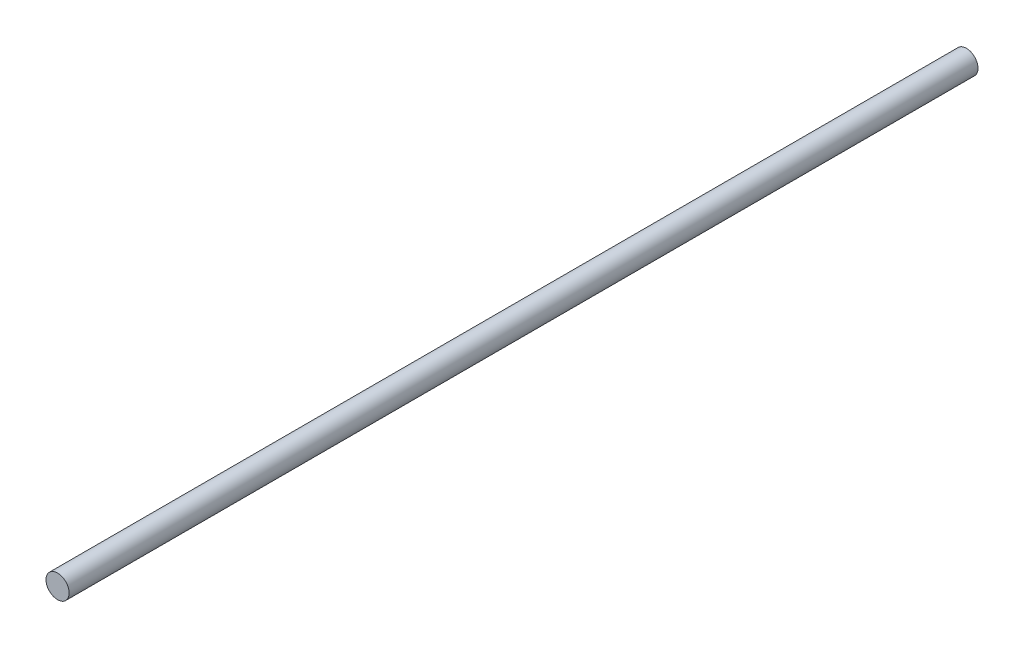
ISO-10303-21;
HEADER;
FILE_DESCRIPTION(('STEP AP214'),'2;1');
FILE_NAME('part.step','',(''),(''),'','','');
FILE_SCHEMA(('AUTOMOTIVE_DESIGN { 1 0 10303 214 1 1 1 1 }'));
ENDSEC;
DATA;
#1=APPLICATION_CONTEXT('core data for automotive mechanical design processes');
#2=APPLICATION_PROTOCOL_DEFINITION('international standard','automotive_design',2000,#1);
#3=PRODUCT_CONTEXT('',#1,'mechanical');
#4=PRODUCT('Part','Part','',(#3));
#5=PRODUCT_RELATED_PRODUCT_CATEGORY('part','',(#4));
#6=PRODUCT_DEFINITION_FORMATION('','',#4);
#7=PRODUCT_DEFINITION_CONTEXT('part definition',#1,'design');
#8=PRODUCT_DEFINITION('design','',#6,#7);
#9=PRODUCT_DEFINITION_SHAPE('','',#8);
#10=(LENGTH_UNIT() NAMED_UNIT(*) SI_UNIT(.MILLI.,.METRE.));
#11=(NAMED_UNIT(*) PLANE_ANGLE_UNIT() SI_UNIT($,.RADIAN.));
#12=(NAMED_UNIT(*) SI_UNIT($,.STERADIAN.) SOLID_ANGLE_UNIT());
#13=UNCERTAINTY_MEASURE_WITH_UNIT(LENGTH_MEASURE(1.E-05),#10,'distance_accuracy_value','');
#14=(GEOMETRIC_REPRESENTATION_CONTEXT(3) GLOBAL_UNCERTAINTY_ASSIGNED_CONTEXT((#13)) GLOBAL_UNIT_ASSIGNED_CONTEXT((#10,
#11,#12)) REPRESENTATION_CONTEXT('',''));
#15=CARTESIAN_POINT('',(0.,0.,0.));
#16=DIRECTION('',(0.,0.,1.));
#17=DIRECTION('',(1.,0.,0.));
#18=AXIS2_PLACEMENT_3D('',#15,#16,#17);
#19=CARTESIAN_POINT('',(0.,0.,314.));
#20=DIRECTION('',(0.,0.,-1.));
#21=DIRECTION('',(-1.,0.,0.));
#22=AXIS2_PLACEMENT_3D('',#19,#20,#21);
#23=CYLINDRICAL_SURFACE('',#22,4.);
#24=CARTESIAN_POINT('',(0.,0.,314.));
#25=DIRECTION('',(0.,0.,1.));
#26=DIRECTION('',(1.,0.,0.));
#27=AXIS2_PLACEMENT_3D('',#24,#25,#26);
#28=CIRCLE('',#27,4.);
#29=CARTESIAN_POINT('',(4.,0.,314.));
#30=VERTEX_POINT('',#29);
#31=EDGE_CURVE('E10',#30,#30,#28,.T.);
#32=ORIENTED_EDGE('',*,*,#31,.F.);
#33=EDGE_LOOP('',(#32));
#34=FACE_BOUND('',#33,.T.);
#35=CARTESIAN_POINT('',(0.,0.,0.));
#36=DIRECTION('',(0.,0.,1.));
#37=DIRECTION('',(1.,0.,0.));
#38=AXIS2_PLACEMENT_3D('',#35,#36,#37);
#39=CIRCLE('',#38,4.);
#40=CARTESIAN_POINT('',(4.,0.,0.));
#41=VERTEX_POINT('',#40);
#42=EDGE_CURVE('E38',#41,#41,#39,.T.);
#43=ORIENTED_EDGE('',*,*,#42,.T.);
#44=EDGE_LOOP('',(#43));
#45=FACE_BOUND('',#44,.T.);
#46=ADVANCED_FACE('F35',(#34,#45),#23,.T.);
#47=CARTESIAN_POINT('',(0.,0.,314.));
#48=DIRECTION('',(0.,0.,1.));
#49=DIRECTION('',(1.,0.,0.));
#50=AXIS2_PLACEMENT_3D('',#47,#48,#49);
#51=PLANE('',#50);
#52=ORIENTED_EDGE('',*,*,#31,.T.);
#53=EDGE_LOOP('',(#52));
#54=FACE_BOUND('',#53,.T.);
#55=ADVANCED_FACE('F50',(#54),#51,.T.);
#56=CARTESIAN_POINT('',(0.,0.,0.));
#57=DIRECTION('',(0.,0.,1.));
#58=DIRECTION('',(1.,0.,0.));
#59=AXIS2_PLACEMENT_3D('',#56,#57,#58);
#60=PLANE('',#59);
#61=ORIENTED_EDGE('',*,*,#42,.F.);
#62=EDGE_LOOP('',(#61));
#63=FACE_BOUND('',#62,.T.);
#64=ADVANCED_FACE('F48',(#63),#60,.F.);
#65=CLOSED_SHELL('',(#46,#55,#64));
#66=MANIFOLD_SOLID_BREP('B2',#65);
#67=ADVANCED_BREP_SHAPE_REPRESENTATION('',(#18,#66),#14);
#68=SHAPE_DEFINITION_REPRESENTATION(#9,#67);
ENDSEC;
END-ISO-10303-21;
